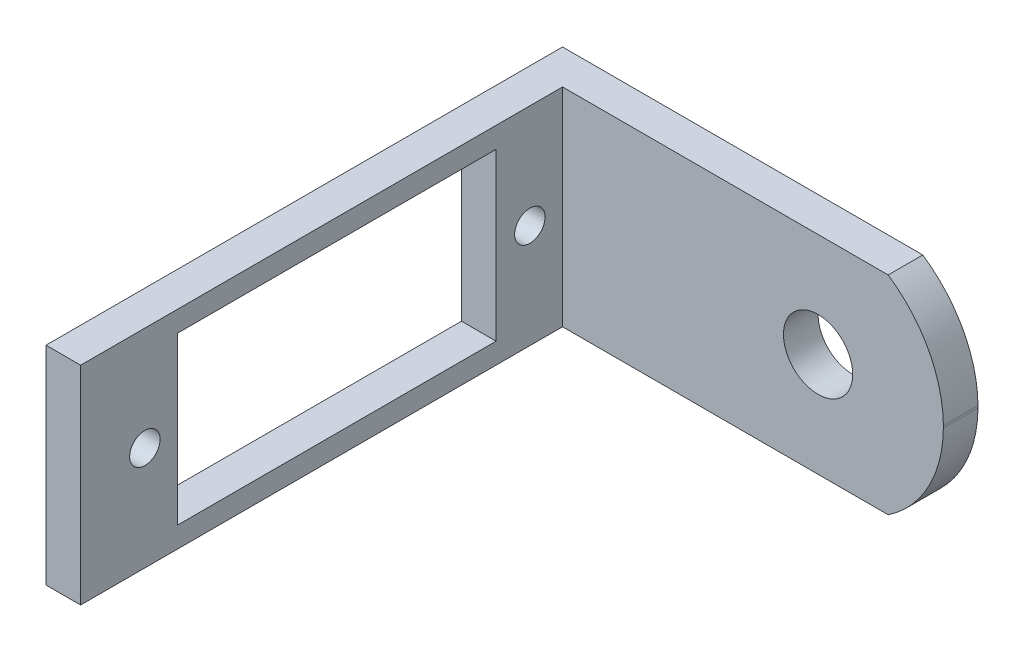
ISO-10303-21;
HEADER;
FILE_DESCRIPTION(('STEP AP214'),'2;1');
FILE_NAME('part.step','',(''),(''),'','','');
FILE_SCHEMA(('AUTOMOTIVE_DESIGN { 1 0 10303 214 1 1 1 1 }'));
ENDSEC;
DATA;
#1=APPLICATION_CONTEXT('core data for automotive mechanical design processes');
#2=APPLICATION_PROTOCOL_DEFINITION('international standard','automotive_design',2000,#1);
#3=PRODUCT_CONTEXT('',#1,'mechanical');
#4=PRODUCT('Part','Part','',(#3));
#5=PRODUCT_RELATED_PRODUCT_CATEGORY('part','',(#4));
#6=PRODUCT_DEFINITION_FORMATION('','',#4);
#7=PRODUCT_DEFINITION_CONTEXT('part definition',#1,'design');
#8=PRODUCT_DEFINITION('design','',#6,#7);
#9=PRODUCT_DEFINITION_SHAPE('','',#8);
#10=(LENGTH_UNIT() NAMED_UNIT(*) SI_UNIT(.MILLI.,.METRE.));
#11=(NAMED_UNIT(*) PLANE_ANGLE_UNIT() SI_UNIT($,.RADIAN.));
#12=(NAMED_UNIT(*) SI_UNIT($,.STERADIAN.) SOLID_ANGLE_UNIT());
#13=UNCERTAINTY_MEASURE_WITH_UNIT(LENGTH_MEASURE(1.E-05),#10,'distance_accuracy_value','');
#14=(GEOMETRIC_REPRESENTATION_CONTEXT(3) GLOBAL_UNCERTAINTY_ASSIGNED_CONTEXT((#13)) GLOBAL_UNIT_ASSIGNED_CONTEXT((#10,
#11,#12)) REPRESENTATION_CONTEXT('',''));
#15=CARTESIAN_POINT('',(0.,0.,0.));
#16=DIRECTION('',(0.,0.,1.));
#17=DIRECTION('',(1.,0.,0.));
#18=AXIS2_PLACEMENT_3D('',#15,#16,#17);
#19=CARTESIAN_POINT('',(30.,0.,2.5));
#20=DIRECTION('',(1.,0.,0.));
#21=DIRECTION('',(0.,1.,0.));
#22=AXIS2_PLACEMENT_3D('',#19,#20,#21);
#23=PLANE('',#22);
#24=DIRECTION('',(0.,0.,1.));
#25=VECTOR('',#24,1.);
#26=CARTESIAN_POINT('',(30.,9.07892708641934,2.5));
#27=LINE('',#26,#25);
#28=CARTESIAN_POINT('',(30.,9.07892708641933,0.));
#29=VERTEX_POINT('',#28);
#30=CARTESIAN_POINT('',(30.,9.07892708641933,2.5));
#31=VERTEX_POINT('',#30);
#32=EDGE_CURVE('E163',#29,#31,#27,.T.);
#33=ORIENTED_EDGE('',*,*,#32,.T.);
#34=DIRECTION('',(0.,1.,0.));
#35=VECTOR('',#34,1.);
#36=CARTESIAN_POINT('',(30.,0.,2.5));
#37=LINE('',#36,#35);
#38=CARTESIAN_POINT('',(30.,8.9210729135856,2.5));
#39=VERTEX_POINT('',#38);
#40=EDGE_CURVE('E233',#39,#31,#37,.T.);
#41=ORIENTED_EDGE('',*,*,#40,.F.);
#42=DIRECTION('',(0.,0.,-1.));
#43=VECTOR('',#42,1.);
#44=CARTESIAN_POINT('',(30.,8.92107291358561,2.5));
#45=LINE('',#44,#43);
#46=CARTESIAN_POINT('',(30.,8.9210729135856,0.));
#47=VERTEX_POINT('',#46);
#48=EDGE_CURVE('E293',#39,#47,#45,.T.);
#49=ORIENTED_EDGE('',*,*,#48,.T.);
#50=DIRECTION('',(0.,1.,0.));
#51=VECTOR('',#50,1.);
#52=CARTESIAN_POINT('',(30.,0.,0.));
#53=LINE('',#52,#51);
#54=EDGE_CURVE('E299',#47,#29,#53,.T.);
#55=ORIENTED_EDGE('',*,*,#54,.T.);
#56=EDGE_LOOP('',(#33,#41,#49,#55));
#57=FACE_BOUND('',#56,.T.);
#58=ADVANCED_FACE('F15',(#57),#23,.T.);
#59=CARTESIAN_POINT('',(0.,15.,30.3));
#60=DIRECTION('',(0.,0.,1.));
#61=DIRECTION('',(1.,0.,0.));
#62=AXIS2_PLACEMENT_3D('',#59,#60,#61);
#63=PLANE('',#62);
#64=DIRECTION('',(0.,1.,0.));
#65=VECTOR('',#64,1.);
#66=CARTESIAN_POINT('',(2.5,7.5,30.3));
#67=LINE('',#66,#65);
#68=CARTESIAN_POINT('',(2.5,3.,30.3));
#69=VERTEX_POINT('',#68);
#70=CARTESIAN_POINT('',(2.5,15.,30.3));
#71=VERTEX_POINT('',#70);
#72=EDGE_CURVE('E259',#69,#71,#67,.T.);
#73=ORIENTED_EDGE('',*,*,#72,.F.);
#74=DIRECTION('',(1.,0.,0.));
#75=VECTOR('',#74,1.);
#76=CARTESIAN_POINT('',(0.,3.,30.3));
#77=LINE('',#76,#75);
#78=CARTESIAN_POINT('',(0.,3.,30.3));
#79=VERTEX_POINT('',#78);
#80=EDGE_CURVE('E9',#79,#69,#77,.T.);
#81=ORIENTED_EDGE('',*,*,#80,.F.);
#82=DIRECTION('',(0.,-1.,0.));
#83=VECTOR('',#82,1.);
#84=CARTESIAN_POINT('',(0.,7.5,30.3));
#85=LINE('',#84,#83);
#86=CARTESIAN_POINT('',(0.,15.,30.3));
#87=VERTEX_POINT('',#86);
#88=EDGE_CURVE('E310',#87,#79,#85,.T.);
#89=ORIENTED_EDGE('',*,*,#88,.F.);
#90=DIRECTION('',(1.,0.,0.));
#91=VECTOR('',#90,1.);
#92=CARTESIAN_POINT('',(0.,15.,30.3));
#93=LINE('',#92,#91);
#94=EDGE_CURVE('E321',#87,#71,#93,.T.);
#95=ORIENTED_EDGE('',*,*,#94,.T.);
#96=EDGE_LOOP('',(#73,#81,#89,#95));
#97=FACE_BOUND('',#96,.T.);
#98=ADVANCED_FACE('F333',(#97),#63,.F.);
#99=CARTESIAN_POINT('',(0.,3.,30.3));
#100=DIRECTION('',(0.,-1.,0.));
#101=DIRECTION('',(0.,0.,-1.));
#102=AXIS2_PLACEMENT_3D('',#99,#100,#101);
#103=PLANE('',#102);
#104=DIRECTION('',(0.,0.,1.));
#105=VECTOR('',#104,1.);
#106=CARTESIAN_POINT('',(2.5,3.,33.8));
#107=LINE('',#106,#105);
#108=CARTESIAN_POINT('',(2.5,3.,7.3));
#109=VERTEX_POINT('',#108);
#110=EDGE_CURVE('E254',#109,#69,#107,.T.);
#111=ORIENTED_EDGE('',*,*,#110,.F.);
#112=DIRECTION('',(1.,0.,0.));
#113=VECTOR('',#112,1.);
#114=CARTESIAN_POINT('',(0.,3.,7.3));
#115=LINE('',#114,#113);
#116=CARTESIAN_POINT('',(0.,3.,7.3));
#117=VERTEX_POINT('',#116);
#118=EDGE_CURVE('E24',#117,#109,#115,.T.);
#119=ORIENTED_EDGE('',*,*,#118,.F.);
#120=DIRECTION('',(0.,0.,-1.));
#121=VECTOR('',#120,1.);
#122=CARTESIAN_POINT('',(0.,3.,15.15));
#123=LINE('',#122,#121);
#124=EDGE_CURVE('E311',#79,#117,#123,.T.);
#125=ORIENTED_EDGE('',*,*,#124,.F.);
#126=ORIENTED_EDGE('',*,*,#80,.T.);
#127=EDGE_LOOP('',(#111,#119,#125,#126));
#128=FACE_BOUND('',#127,.T.);
#129=ADVANCED_FACE('F17',(#128),#103,.F.);
#130=CARTESIAN_POINT('',(0.,3.,7.3));
#131=DIRECTION('',(0.,0.,-1.));
#132=DIRECTION('',(0.,-1.,0.));
#133=AXIS2_PLACEMENT_3D('',#130,#131,#132);
#134=PLANE('',#133);
#135=DIRECTION('',(0.,-1.,0.));
#136=VECTOR('',#135,1.);
#137=CARTESIAN_POINT('',(2.5,1.5,7.3));
#138=LINE('',#137,#136);
#139=CARTESIAN_POINT('',(2.5,15.,7.3));
#140=VERTEX_POINT('',#139);
#141=EDGE_CURVE('E253',#140,#109,#138,.T.);
#142=ORIENTED_EDGE('',*,*,#141,.F.);
#143=DIRECTION('',(1.,0.,0.));
#144=VECTOR('',#143,1.);
#145=CARTESIAN_POINT('',(0.,15.,7.3));
#146=LINE('',#145,#144);
#147=CARTESIAN_POINT('',(0.,15.,7.3));
#148=VERTEX_POINT('',#147);
#149=EDGE_CURVE('E296',#148,#140,#146,.T.);
#150=ORIENTED_EDGE('',*,*,#149,.F.);
#151=DIRECTION('',(0.,1.,0.));
#152=VECTOR('',#151,1.);
#153=CARTESIAN_POINT('',(0.,1.5,7.3));
#154=LINE('',#153,#152);
#155=EDGE_CURVE('E320',#117,#148,#154,.T.);
#156=ORIENTED_EDGE('',*,*,#155,.F.);
#157=ORIENTED_EDGE('',*,*,#118,.T.);
#158=EDGE_LOOP('',(#142,#150,#156,#157));
#159=FACE_BOUND('',#158,.T.);
#160=ADVANCED_FACE('F332',(#159),#134,.F.);
#161=CARTESIAN_POINT('',(0.,15.,7.3));
#162=DIRECTION('',(0.,1.,0.));
#163=DIRECTION('',(1.,0.,0.));
#164=AXIS2_PLACEMENT_3D('',#161,#162,#163);
#165=PLANE('',#164);
#166=DIRECTION('',(0.,0.,-1.));
#167=VECTOR('',#166,1.);
#168=CARTESIAN_POINT('',(2.5,15.,22.3));
#169=LINE('',#168,#167);
#170=EDGE_CURVE('E250',#71,#140,#169,.T.);
#171=ORIENTED_EDGE('',*,*,#170,.F.);
#172=ORIENTED_EDGE('',*,*,#94,.F.);
#173=DIRECTION('',(0.,0.,1.));
#174=VECTOR('',#173,1.);
#175=CARTESIAN_POINT('',(0.,15.,3.65));
#176=LINE('',#175,#174);
#177=EDGE_CURVE('E304',#148,#87,#176,.T.);
#178=ORIENTED_EDGE('',*,*,#177,.F.);
#179=ORIENTED_EDGE('',*,*,#149,.T.);
#180=EDGE_LOOP('',(#171,#172,#178,#179));
#181=FACE_BOUND('',#180,.T.);
#182=ADVANCED_FACE('F328',(#181),#165,.F.);
#183=CARTESIAN_POINT('',(0.,0.,0.));
#184=DIRECTION('',(-1.,0.,0.));
#185=DIRECTION('',(0.,0.,1.));
#186=AXIS2_PLACEMENT_3D('',#183,#184,#185);
#187=PLANE('',#186);
#188=ORIENTED_EDGE('',*,*,#177,.T.);
#189=ORIENTED_EDGE('',*,*,#88,.T.);
#190=ORIENTED_EDGE('',*,*,#124,.T.);
#191=ORIENTED_EDGE('',*,*,#155,.T.);
#192=EDGE_LOOP('',(#188,#189,#190,#191));
#193=FACE_BOUND('',#192,.T.);
#194=CARTESIAN_POINT('',(0.,9.,4.86));
#195=DIRECTION('',(1.,0.,0.));
#196=DIRECTION('',(0.,-1.,0.));
#197=AXIS2_PLACEMENT_3D('',#194,#195,#196);
#198=CIRCLE('',#197,1.1);
#199=CARTESIAN_POINT('',(0.,10.1,4.86));
#200=VERTEX_POINT('',#199);
#201=EDGE_CURVE('E196',#200,#200,#198,.T.);
#202=ORIENTED_EDGE('',*,*,#201,.T.);
#203=EDGE_LOOP('',(#202));
#204=FACE_BOUND('',#203,.T.);
#205=CARTESIAN_POINT('',(0.,9.,32.66));
#206=DIRECTION('',(1.,0.,0.));
#207=DIRECTION('',(0.,-1.,0.));
#208=AXIS2_PLACEMENT_3D('',#205,#206,#207);
#209=CIRCLE('',#208,1.1);
#210=CARTESIAN_POINT('',(0.,10.1,32.66));
#211=VERTEX_POINT('',#210);
#212=EDGE_CURVE('E200',#211,#211,#209,.T.);
#213=ORIENTED_EDGE('',*,*,#212,.T.);
#214=EDGE_LOOP('',(#213));
#215=FACE_BOUND('',#214,.T.);
#216=DIRECTION('',(0.,0.,-1.));
#217=VECTOR('',#216,1.);
#218=CARTESIAN_POINT('',(0.,16.5,10.4808875940012));
#219=LINE('',#218,#217);
#220=CARTESIAN_POINT('',(0.,16.5,37.3));
#221=VERTEX_POINT('',#220);
#222=CARTESIAN_POINT('',(0.,16.5,0.));
#223=VERTEX_POINT('',#222);
#224=EDGE_CURVE('E178',#221,#223,#219,.T.);
#225=ORIENTED_EDGE('',*,*,#224,.T.);
#226=DIRECTION('',(0.,1.,0.));
#227=VECTOR('',#226,1.);
#228=CARTESIAN_POINT('',(0.,0.,0.));
#229=LINE('',#228,#227);
#230=CARTESIAN_POINT('',(0.,1.5,0.));
#231=VERTEX_POINT('',#230);
#232=EDGE_CURVE('E174',#231,#223,#229,.T.);
#233=ORIENTED_EDGE('',*,*,#232,.F.);
#234=DIRECTION('',(0.,0.,1.));
#235=VECTOR('',#234,1.);
#236=CARTESIAN_POINT('',(0.,1.5,11.4896180604371));
#237=LINE('',#236,#235);
#238=CARTESIAN_POINT('',(0.,1.5,37.3));
#239=VERTEX_POINT('',#238);
#240=EDGE_CURVE('E217',#231,#239,#237,.T.);
#241=ORIENTED_EDGE('',*,*,#240,.T.);
#242=DIRECTION('',(0.,1.,0.));
#243=VECTOR('',#242,1.);
#244=CARTESIAN_POINT('',(0.,0.,37.3));
#245=LINE('',#244,#243);
#246=EDGE_CURVE('E263',#239,#221,#245,.T.);
#247=ORIENTED_EDGE('',*,*,#246,.T.);
#248=EDGE_LOOP('',(#225,#233,#241,#247));
#249=FACE_BOUND('',#248,.T.);
#250=ADVANCED_FACE('F337',(#193,#204,#215,#249),#187,.T.);
#251=CARTESIAN_POINT('',(30.,0.,0.));
#252=DIRECTION('',(0.,0.,-1.));
#253=DIRECTION('',(0.,-1.,0.));
#254=AXIS2_PLACEMENT_3D('',#251,#252,#253);
#255=PLANE('',#254);
#256=CARTESIAN_POINT('',(20.9512858926243,9.00000000000247,0.));
#257=DIRECTION('',(0.,0.,1.));
#258=DIRECTION('',(-1.,0.,0.));
#259=AXIS2_PLACEMENT_3D('',#256,#257,#258);
#260=CIRCLE('',#259,2.5);
#261=CARTESIAN_POINT('',(23.4512858926243,9.00000000000247,0.));
#262=VERTEX_POINT('',#261);
#263=EDGE_CURVE('E286',#262,#262,#260,.T.);
#264=ORIENTED_EDGE('',*,*,#263,.T.);
#265=EDGE_LOOP('',(#264));
#266=FACE_BOUND('',#265,.T.);
#267=DIRECTION('',(1.,0.,0.));
#268=VECTOR('',#267,1.);
#269=CARTESIAN_POINT('',(24.6984602215324,16.5,0.));
#270=LINE('',#269,#268);
#271=CARTESIAN_POINT('',(26.0144327877901,16.5,0.));
#272=VERTEX_POINT('',#271);
#273=EDGE_CURVE('E168',#223,#272,#270,.T.);
#274=ORIENTED_EDGE('',*,*,#273,.T.);
#275=CARTESIAN_POINT('',(20.9512858926243,9.00000000000247,0.));
#276=DIRECTION('',(0.,0.,-1.));
#277=DIRECTION('',(-0.103987281212699,-0.994578627030559,0.));
#278=AXIS2_PLACEMENT_3D('',#275,#276,#277);
#279=CIRCLE('',#278,9.04905832017839);
#280=EDGE_CURVE('E158',#272,#29,#279,.T.);
#281=ORIENTED_EDGE('',*,*,#280,.T.);
#282=ORIENTED_EDGE('',*,*,#54,.F.);
#283=CARTESIAN_POINT('',(20.9512858926243,9.00000000000247,0.));
#284=DIRECTION('',(0.,0.,-1.));
#285=DIRECTION('',(-0.103987281212699,-0.994578627030559,0.));
#286=AXIS2_PLACEMENT_3D('',#283,#284,#285);
#287=CIRCLE('',#286,9.04905832017839);
#288=CARTESIAN_POINT('',(26.0144327877828,1.5,0.));
#289=VERTEX_POINT('',#288);
#290=EDGE_CURVE('E170',#47,#289,#287,.T.);
#291=ORIENTED_EDGE('',*,*,#290,.T.);
#292=DIRECTION('',(-1.,0.,0.));
#293=VECTOR('',#292,1.);
#294=CARTESIAN_POINT('',(23.871200524791,1.5,0.));
#295=LINE('',#294,#293);
#296=EDGE_CURVE('E269',#289,#231,#295,.T.);
#297=ORIENTED_EDGE('',*,*,#296,.T.);
#298=ORIENTED_EDGE('',*,*,#232,.T.);
#299=EDGE_LOOP('',(#274,#281,#282,#291,#297,#298));
#300=FACE_BOUND('',#299,.T.);
#301=ADVANCED_FACE('F171',(#266,#300),#255,.T.);
#302=CARTESIAN_POINT('',(20.9512858926243,9.00000000000247,2.5));
#303=DIRECTION('',(0.,0.,-1.));
#304=DIRECTION('',(-0.103987281212699,-0.994578627030559,0.));
#305=AXIS2_PLACEMENT_3D('',#302,#303,#304);
#306=CYLINDRICAL_SURFACE('',#305,9.04905832017839);
#307=DIRECTION('',(0.,0.,-1.));
#308=VECTOR('',#307,1.);
#309=CARTESIAN_POINT('',(26.0144327877828,1.5,2.5));
#310=LINE('',#309,#308);
#311=CARTESIAN_POINT('',(26.0144327877828,1.5,2.5));
#312=VERTEX_POINT('',#311);
#313=EDGE_CURVE('E212',#312,#289,#310,.T.);
#314=ORIENTED_EDGE('',*,*,#313,.T.);
#315=ORIENTED_EDGE('',*,*,#290,.F.);
#316=ORIENTED_EDGE('',*,*,#48,.F.);
#317=CARTESIAN_POINT('',(20.9512858926243,9.00000000000247,2.5));
#318=DIRECTION('',(0.,0.,1.));
#319=DIRECTION('',(-0.103987281212699,-0.994578627030559,0.));
#320=AXIS2_PLACEMENT_3D('',#317,#318,#319);
#321=CIRCLE('',#320,9.04905832017839);
#322=EDGE_CURVE('E226',#312,#39,#321,.T.);
#323=ORIENTED_EDGE('',*,*,#322,.F.);
#324=EDGE_LOOP('',(#314,#315,#316,#323));
#325=FACE_BOUND('',#324,.T.);
#326=ADVANCED_FACE('F381',(#325),#306,.T.);
#327=CARTESIAN_POINT('',(20.9512858926243,9.00000000000247,2.5));
#328=DIRECTION('',(0.,0.,-1.));
#329=DIRECTION('',(-0.103987281212699,-0.994578627030559,0.));
#330=AXIS2_PLACEMENT_3D('',#327,#328,#329);
#331=CYLINDRICAL_SURFACE('',#330,9.04905832017839);
#332=DIRECTION('',(0.,0.,1.));
#333=VECTOR('',#332,1.);
#334=CARTESIAN_POINT('',(26.0144327877901,16.5,2.5));
#335=LINE('',#334,#333);
#336=CARTESIAN_POINT('',(26.0144327877901,16.5,2.5));
#337=VERTEX_POINT('',#336);
#338=EDGE_CURVE('E162',#272,#337,#335,.T.);
#339=ORIENTED_EDGE('',*,*,#338,.T.);
#340=CARTESIAN_POINT('',(20.9512858926243,9.00000000000247,2.5));
#341=DIRECTION('',(0.,0.,1.));
#342=DIRECTION('',(-0.103987281212699,-0.994578627030559,0.));
#343=AXIS2_PLACEMENT_3D('',#340,#341,#342);
#344=CIRCLE('',#343,9.04905832017839);
#345=EDGE_CURVE('E236',#31,#337,#344,.T.);
#346=ORIENTED_EDGE('',*,*,#345,.F.);
#347=ORIENTED_EDGE('',*,*,#32,.F.);
#348=ORIENTED_EDGE('',*,*,#280,.F.);
#349=EDGE_LOOP('',(#339,#346,#347,#348));
#350=FACE_BOUND('',#349,.T.);
#351=ADVANCED_FACE('F159',(#350),#331,.T.);
#352=CARTESIAN_POINT('',(20.9512858926243,9.00000000000247,2.5));
#353=DIRECTION('',(0.,0.,-1.));
#354=DIRECTION('',(-1.,0.,0.));
#355=AXIS2_PLACEMENT_3D('',#352,#353,#354);
#356=CYLINDRICAL_SURFACE('',#355,2.5);
#357=CARTESIAN_POINT('',(20.9512858926243,9.00000000000247,2.5));
#358=DIRECTION('',(0.,0.,-1.));
#359=DIRECTION('',(-1.,0.,0.));
#360=AXIS2_PLACEMENT_3D('',#357,#358,#359);
#361=CIRCLE('',#360,2.5);
#362=CARTESIAN_POINT('',(23.4512858926243,9.00000000000247,2.5));
#363=VERTEX_POINT('',#362);
#364=EDGE_CURVE('E228',#363,#363,#361,.T.);
#365=ORIENTED_EDGE('',*,*,#364,.F.);
#366=DIRECTION('',(0.,0.,-1.));
#367=VECTOR('',#366,1.);
#368=CARTESIAN_POINT('',(23.4512858926243,9.00000000000247,2.5));
#369=LINE('',#368,#367);
#370=EDGE_CURVE('E282',#363,#262,#369,.T.);
#371=ORIENTED_EDGE('',*,*,#370,.T.);
#372=ORIENTED_EDGE('',*,*,#263,.F.);
#373=ORIENTED_EDGE('',*,*,#370,.F.);
#374=EDGE_LOOP('',(#365,#371,#372,#373));
#375=FACE_BOUND('',#374,.T.);
#376=ADVANCED_FACE('F359',(#375),#356,.F.);
#377=CARTESIAN_POINT('',(0.,9.,4.86));
#378=DIRECTION('',(1.,0.,0.));
#379=DIRECTION('',(0.,-1.,0.));
#380=AXIS2_PLACEMENT_3D('',#377,#378,#379);
#381=CYLINDRICAL_SURFACE('',#380,1.1);
#382=ORIENTED_EDGE('',*,*,#201,.F.);
#383=DIRECTION('',(1.,0.,0.));
#384=VECTOR('',#383,1.);
#385=CARTESIAN_POINT('',(0.,10.1,4.86));
#386=LINE('',#385,#384);
#387=CARTESIAN_POINT('',(2.5,10.1,4.86));
#388=VERTEX_POINT('',#387);
#389=EDGE_CURVE('E276',#200,#388,#386,.T.);
#390=ORIENTED_EDGE('',*,*,#389,.T.);
#391=CARTESIAN_POINT('',(2.5,9.,4.86));
#392=DIRECTION('',(-1.,0.,0.));
#393=DIRECTION('',(0.,-1.,0.));
#394=AXIS2_PLACEMENT_3D('',#391,#392,#393);
#395=CIRCLE('',#394,1.1);
#396=EDGE_CURVE('E242',#388,#388,#395,.T.);
#397=ORIENTED_EDGE('',*,*,#396,.F.);
#398=ORIENTED_EDGE('',*,*,#389,.F.);
#399=EDGE_LOOP('',(#382,#390,#397,#398));
#400=FACE_BOUND('',#399,.T.);
#401=ADVANCED_FACE('F361',(#400),#381,.F.);
#402=CARTESIAN_POINT('',(0.,9.,32.66));
#403=DIRECTION('',(1.,0.,0.));
#404=DIRECTION('',(0.,-1.,0.));
#405=AXIS2_PLACEMENT_3D('',#402,#403,#404);
#406=CYLINDRICAL_SURFACE('',#405,1.1);
#407=ORIENTED_EDGE('',*,*,#212,.F.);
#408=DIRECTION('',(1.,0.,0.));
#409=VECTOR('',#408,1.);
#410=CARTESIAN_POINT('',(0.,10.1,32.66));
#411=LINE('',#410,#409);
#412=CARTESIAN_POINT('',(2.5,10.1,32.66));
#413=VERTEX_POINT('',#412);
#414=EDGE_CURVE('E194',#211,#413,#411,.T.);
#415=ORIENTED_EDGE('',*,*,#414,.T.);
#416=CARTESIAN_POINT('',(2.5,9.,32.66));
#417=DIRECTION('',(-1.,0.,0.));
#418=DIRECTION('',(0.,-1.,0.));
#419=AXIS2_PLACEMENT_3D('',#416,#417,#418);
#420=CIRCLE('',#419,1.1);
#421=EDGE_CURVE('E189',#413,#413,#420,.T.);
#422=ORIENTED_EDGE('',*,*,#421,.F.);
#423=ORIENTED_EDGE('',*,*,#414,.F.);
#424=EDGE_LOOP('',(#407,#415,#422,#423));
#425=FACE_BOUND('',#424,.T.);
#426=ADVANCED_FACE('F366',(#425),#406,.F.);
#427=CARTESIAN_POINT('',(17.742401049582,1.5,22.9792361208741));
#428=DIRECTION('',(0.,1.,0.));
#429=DIRECTION('',(1.,0.,0.));
#430=AXIS2_PLACEMENT_3D('',#427,#428,#429);
#431=PLANE('',#430);
#432=ORIENTED_EDGE('',*,*,#313,.F.);
#433=DIRECTION('',(1.,0.,0.));
#434=VECTOR('',#433,1.);
#435=CARTESIAN_POINT('',(10.121200524791,1.5,2.5));
#436=LINE('',#435,#434);
#437=CARTESIAN_POINT('',(2.5,1.5,2.5));
#438=VERTEX_POINT('',#437);
#439=EDGE_CURVE('E225',#438,#312,#436,.T.);
#440=ORIENTED_EDGE('',*,*,#439,.F.);
#441=DIRECTION('',(0.,0.,-1.));
#442=VECTOR('',#441,1.);
#443=CARTESIAN_POINT('',(2.5,1.5,30.1396180604371));
#444=LINE('',#443,#442);
#445=CARTESIAN_POINT('',(2.5,1.5,37.3));
#446=VERTEX_POINT('',#445);
#447=EDGE_CURVE('E209',#446,#438,#444,.T.);
#448=ORIENTED_EDGE('',*,*,#447,.F.);
#449=DIRECTION('',(1.,0.,0.));
#450=VECTOR('',#449,1.);
#451=CARTESIAN_POINT('',(8.87120052479101,1.5,37.3));
#452=LINE('',#451,#450);
#453=EDGE_CURVE('E218',#239,#446,#452,.T.);
#454=ORIENTED_EDGE('',*,*,#453,.F.);
#455=ORIENTED_EDGE('',*,*,#240,.F.);
#456=ORIENTED_EDGE('',*,*,#296,.F.);
#457=EDGE_LOOP('',(#432,#440,#448,#454,#455,#456));
#458=FACE_BOUND('',#457,.T.);
#459=ADVANCED_FACE('F364',(#458),#431,.F.);
#460=CARTESIAN_POINT('',(0.,0.,37.3));
#461=DIRECTION('',(0.,0.,1.));
#462=DIRECTION('',(1.,0.,0.));
#463=AXIS2_PLACEMENT_3D('',#460,#461,#462);
#464=PLANE('',#463);
#465=DIRECTION('',(-1.,0.,0.));
#466=VECTOR('',#465,1.);
#467=CARTESIAN_POINT('',(9.69846022153239,16.5,37.3));
#468=LINE('',#467,#466);
#469=CARTESIAN_POINT('',(2.5,16.5,37.3));
#470=VERTEX_POINT('',#469);
#471=EDGE_CURVE('E192',#470,#221,#468,.T.);
#472=ORIENTED_EDGE('',*,*,#471,.T.);
#473=ORIENTED_EDGE('',*,*,#246,.F.);
#474=ORIENTED_EDGE('',*,*,#453,.T.);
#475=DIRECTION('',(0.,1.,0.));
#476=VECTOR('',#475,1.);
#477=CARTESIAN_POINT('',(2.5,0.,37.3));
#478=LINE('',#477,#476);
#479=EDGE_CURVE('E213',#446,#470,#478,.T.);
#480=ORIENTED_EDGE('',*,*,#479,.T.);
#481=EDGE_LOOP('',(#472,#473,#474,#480));
#482=FACE_BOUND('',#481,.T.);
#483=ADVANCED_FACE('F357',(#482),#464,.T.);
#484=CARTESIAN_POINT('',(2.5,0.,37.3));
#485=DIRECTION('',(1.,0.,0.));
#486=DIRECTION('',(0.,1.,0.));
#487=AXIS2_PLACEMENT_3D('',#484,#485,#486);
#488=PLANE('',#487);
#489=ORIENTED_EDGE('',*,*,#170,.T.);
#490=ORIENTED_EDGE('',*,*,#141,.T.);
#491=ORIENTED_EDGE('',*,*,#110,.T.);
#492=ORIENTED_EDGE('',*,*,#72,.T.);
#493=EDGE_LOOP('',(#489,#490,#491,#492));
#494=FACE_BOUND('',#493,.T.);
#495=ORIENTED_EDGE('',*,*,#396,.T.);
#496=EDGE_LOOP('',(#495));
#497=FACE_BOUND('',#496,.T.);
#498=ORIENTED_EDGE('',*,*,#421,.T.);
#499=EDGE_LOOP('',(#498));
#500=FACE_BOUND('',#499,.T.);
#501=DIRECTION('',(0.,0.,1.));
#502=VECTOR('',#501,1.);
#503=CARTESIAN_POINT('',(2.5,16.5,29.1308875940012));
#504=LINE('',#503,#502);
#505=CARTESIAN_POINT('',(2.5,16.5,2.5));
#506=VERTEX_POINT('',#505);
#507=EDGE_CURVE('E201',#506,#470,#504,.T.);
#508=ORIENTED_EDGE('',*,*,#507,.T.);
#509=ORIENTED_EDGE('',*,*,#479,.F.);
#510=ORIENTED_EDGE('',*,*,#447,.T.);
#511=DIRECTION('',(0.,1.,0.));
#512=VECTOR('',#511,1.);
#513=CARTESIAN_POINT('',(2.5,0.,2.5));
#514=LINE('',#513,#512);
#515=EDGE_CURVE('E207',#438,#506,#514,.T.);
#516=ORIENTED_EDGE('',*,*,#515,.T.);
#517=EDGE_LOOP('',(#508,#509,#510,#516));
#518=FACE_BOUND('',#517,.T.);
#519=ADVANCED_FACE('F334',(#494,#497,#500,#518),#488,.T.);
#520=CARTESIAN_POINT('',(2.5,0.,2.5));
#521=DIRECTION('',(0.,0.,1.));
#522=DIRECTION('',(1.,0.,0.));
#523=AXIS2_PLACEMENT_3D('',#520,#521,#522);
#524=PLANE('',#523);
#525=ORIENTED_EDGE('',*,*,#364,.T.);
#526=EDGE_LOOP('',(#525));
#527=FACE_BOUND('',#526,.T.);
#528=DIRECTION('',(-1.,0.,0.));
#529=VECTOR('',#528,1.);
#530=CARTESIAN_POINT('',(10.9484602215324,16.5,2.5));
#531=LINE('',#530,#529);
#532=EDGE_CURVE('E182',#337,#506,#531,.T.);
#533=ORIENTED_EDGE('',*,*,#532,.T.);
#534=ORIENTED_EDGE('',*,*,#515,.F.);
#535=ORIENTED_EDGE('',*,*,#439,.T.);
#536=ORIENTED_EDGE('',*,*,#322,.T.);
#537=ORIENTED_EDGE('',*,*,#40,.T.);
#538=ORIENTED_EDGE('',*,*,#345,.T.);
#539=EDGE_LOOP('',(#533,#534,#535,#536,#537,#538));
#540=FACE_BOUND('',#539,.T.);
#541=ADVANCED_FACE('F352',(#527,#540),#524,.T.);
#542=CARTESIAN_POINT('',(19.3969204430648,16.5,20.9617751880025));
#543=DIRECTION('',(0.,-1.,0.));
#544=DIRECTION('',(0.,0.,-1.));
#545=AXIS2_PLACEMENT_3D('',#542,#543,#544);
#546=PLANE('',#545);
#547=ORIENTED_EDGE('',*,*,#338,.F.);
#548=ORIENTED_EDGE('',*,*,#273,.F.);
#549=ORIENTED_EDGE('',*,*,#224,.F.);
#550=ORIENTED_EDGE('',*,*,#471,.F.);
#551=ORIENTED_EDGE('',*,*,#507,.F.);
#552=ORIENTED_EDGE('',*,*,#532,.F.);
#553=EDGE_LOOP('',(#547,#548,#549,#550,#551,#552));
#554=FACE_BOUND('',#553,.T.);
#555=ADVANCED_FACE('F185',(#554),#546,.F.);
#556=CLOSED_SHELL('',(#58,#98,#129,#160,#182,#250,#301,#326,#351,#376,#401,#426,#459,#483,#519,
#541,#555));
#557=MANIFOLD_SOLID_BREP('B1',#556);
#558=ADVANCED_BREP_SHAPE_REPRESENTATION('',(#18,#557),#14);
#559=SHAPE_DEFINITION_REPRESENTATION(#9,#558);
ENDSEC;
END-ISO-10303-21;
